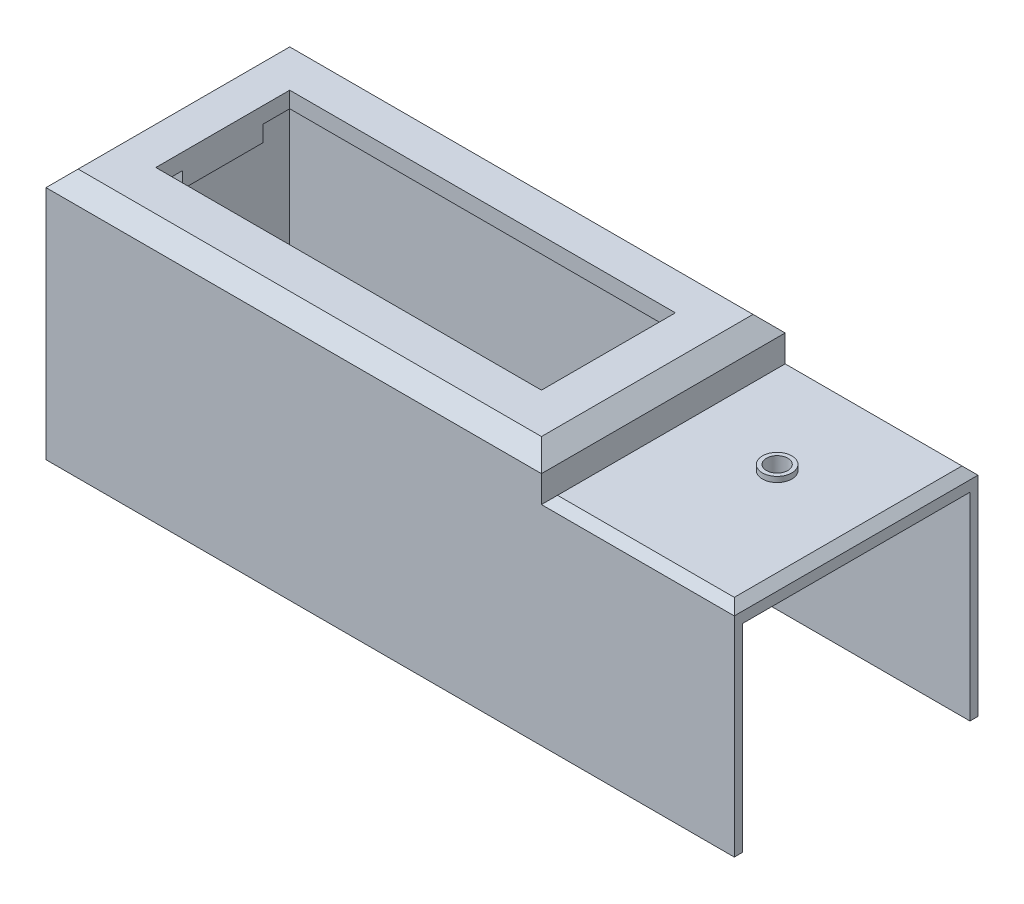
ISO-10303-21;
HEADER;
FILE_DESCRIPTION(('STEP AP214'),'2;1');
FILE_NAME('part.step','',(''),(''),'','','');
FILE_SCHEMA(('AUTOMOTIVE_DESIGN { 1 0 10303 214 1 1 1 1 }'));
ENDSEC;
DATA;
#1=APPLICATION_CONTEXT('core data for automotive mechanical design processes');
#2=APPLICATION_PROTOCOL_DEFINITION('international standard','automotive_design',2000,#1);
#3=PRODUCT_CONTEXT('',#1,'mechanical');
#4=PRODUCT('Part','Part','',(#3));
#5=PRODUCT_RELATED_PRODUCT_CATEGORY('part','',(#4));
#6=PRODUCT_DEFINITION_FORMATION('','',#4);
#7=PRODUCT_DEFINITION_CONTEXT('part definition',#1,'design');
#8=PRODUCT_DEFINITION('design','',#6,#7);
#9=PRODUCT_DEFINITION_SHAPE('','',#8);
#10=(LENGTH_UNIT() NAMED_UNIT(*) SI_UNIT(.MILLI.,.METRE.));
#11=(NAMED_UNIT(*) PLANE_ANGLE_UNIT() SI_UNIT($,.RADIAN.));
#12=(NAMED_UNIT(*) SI_UNIT($,.STERADIAN.) SOLID_ANGLE_UNIT());
#13=UNCERTAINTY_MEASURE_WITH_UNIT(LENGTH_MEASURE(1.E-05),#10,'distance_accuracy_value','');
#14=(GEOMETRIC_REPRESENTATION_CONTEXT(3) GLOBAL_UNCERTAINTY_ASSIGNED_CONTEXT((#13)) GLOBAL_UNIT_ASSIGNED_CONTEXT((#10,
#11,#12)) REPRESENTATION_CONTEXT('',''));
#15=CARTESIAN_POINT('',(0.,0.,0.));
#16=DIRECTION('',(0.,0.,1.));
#17=DIRECTION('',(1.,0.,0.));
#18=AXIS2_PLACEMENT_3D('',#15,#16,#17);
#19=CARTESIAN_POINT('',(0.,-3.,0.));
#20=DIRECTION('',(0.,1.,0.));
#21=DIRECTION('',(0.,0.,1.));
#22=AXIS2_PLACEMENT_3D('',#19,#20,#21);
#23=PLANE('',#22);
#24=DIRECTION('',(1.,0.,0.));
#25=VECTOR('',#24,1.);
#26=CARTESIAN_POINT('',(45.,-3.,-21.));
#27=LINE('',#26,#25);
#28=CARTESIAN_POINT('',(-44.5,-3.,-21.));
#29=VERTEX_POINT('',#28);
#30=CARTESIAN_POINT('',(45.,-3.,-21.));
#31=VERTEX_POINT('',#30);
#32=EDGE_CURVE('E363',#29,#31,#27,.T.);
#33=ORIENTED_EDGE('',*,*,#32,.T.);
#34=DIRECTION('',(0.,0.,1.));
#35=VECTOR('',#34,1.);
#36=CARTESIAN_POINT('',(45.,-3.,-21.));
#37=LINE('',#36,#35);
#38=CARTESIAN_POINT('',(45.,-3.,21.5));
#39=VERTEX_POINT('',#38);
#40=EDGE_CURVE('E353',#31,#39,#37,.T.);
#41=ORIENTED_EDGE('',*,*,#40,.T.);
#42=DIRECTION('',(-1.,0.,0.));
#43=VECTOR('',#42,1.);
#44=CARTESIAN_POINT('',(45.,-3.,21.5));
#45=LINE('',#44,#43);
#46=CARTESIAN_POINT('',(-44.5,-3.,21.5));
#47=VERTEX_POINT('',#46);
#48=EDGE_CURVE('E356',#39,#47,#45,.T.);
#49=ORIENTED_EDGE('',*,*,#48,.T.);
#50=DIRECTION('',(0.,0.,-1.));
#51=VECTOR('',#50,1.);
#52=CARTESIAN_POINT('',(-44.5,-3.,-21.));
#53=LINE('',#52,#51);
#54=EDGE_CURVE('E360',#47,#29,#53,.T.);
#55=ORIENTED_EDGE('',*,*,#54,.T.);
#56=EDGE_LOOP('',(#33,#41,#49,#55));
#57=FACE_BOUND('',#56,.T.);
#58=DIRECTION('',(-1.,0.,0.));
#59=VECTOR('',#58,1.);
#60=CARTESIAN_POINT('',(-36.,-3.,7.5));
#61=LINE('',#60,#59);
#62=CARTESIAN_POINT('',(-36.,-3.,7.5));
#63=VERTEX_POINT('',#62);
#64=CARTESIAN_POINT('',(-40.,-3.,7.5));
#65=VERTEX_POINT('',#64);
#66=EDGE_CURVE('E334',#63,#65,#61,.T.);
#67=ORIENTED_EDGE('',*,*,#66,.F.);
#68=DIRECTION('',(0.,0.,1.));
#69=VECTOR('',#68,1.);
#70=CARTESIAN_POINT('',(-36.,-3.,0.));
#71=LINE('',#70,#69);
#72=CARTESIAN_POINT('',(-36.,-3.,12.5));
#73=VERTEX_POINT('',#72);
#74=EDGE_CURVE('E402',#63,#73,#71,.T.);
#75=ORIENTED_EDGE('',*,*,#74,.T.);
#76=DIRECTION('',(1.,0.,0.));
#77=VECTOR('',#76,1.);
#78=CARTESIAN_POINT('',(0.,-3.,12.5));
#79=LINE('',#78,#77);
#80=CARTESIAN_POINT('',(36.,-3.,12.5));
#81=VERTEX_POINT('',#80);
#82=EDGE_CURVE('E405',#73,#81,#79,.T.);
#83=ORIENTED_EDGE('',*,*,#82,.T.);
#84=DIRECTION('',(0.,0.,-1.));
#85=VECTOR('',#84,1.);
#86=CARTESIAN_POINT('',(36.,-3.,0.));
#87=LINE('',#86,#85);
#88=CARTESIAN_POINT('',(36.,-3.,-12.5));
#89=VERTEX_POINT('',#88);
#90=EDGE_CURVE('E390',#81,#89,#87,.T.);
#91=ORIENTED_EDGE('',*,*,#90,.T.);
#92=DIRECTION('',(-1.,0.,0.));
#93=VECTOR('',#92,1.);
#94=CARTESIAN_POINT('',(0.,-3.,-12.5));
#95=LINE('',#94,#93);
#96=CARTESIAN_POINT('',(-36.,-3.,-12.5));
#97=VERTEX_POINT('',#96);
#98=EDGE_CURVE('E399',#89,#97,#95,.T.);
#99=ORIENTED_EDGE('',*,*,#98,.T.);
#100=CARTESIAN_POINT('',(-36.,-3.,-7.5));
#101=VERTEX_POINT('',#100);
#102=EDGE_CURVE('E403',#97,#101,#71,.T.);
#103=ORIENTED_EDGE('',*,*,#102,.T.);
#104=DIRECTION('',(1.,0.,0.));
#105=VECTOR('',#104,1.);
#106=CARTESIAN_POINT('',(-36.,-3.,-7.5));
#107=LINE('',#106,#105);
#108=CARTESIAN_POINT('',(-40.,-3.,-7.5));
#109=VERTEX_POINT('',#108);
#110=EDGE_CURVE('E172',#109,#101,#107,.T.);
#111=ORIENTED_EDGE('',*,*,#110,.F.);
#112=DIRECTION('',(0.,0.,-1.));
#113=VECTOR('',#112,1.);
#114=CARTESIAN_POINT('',(-40.,-3.,7.5));
#115=LINE('',#114,#113);
#116=EDGE_CURVE('E167',#65,#109,#115,.T.);
#117=ORIENTED_EDGE('',*,*,#116,.F.);
#118=EDGE_LOOP('',(#67,#75,#83,#91,#99,#103,#111,#117));
#119=FACE_BOUND('',#118,.T.);
#120=ADVANCED_FACE('F149',(#57,#119),#23,.F.);
#121=CARTESIAN_POINT('',(0.,-10.,0.));
#122=DIRECTION('',(0.,-1.,0.));
#123=DIRECTION('',(0.,0.,-1.));
#124=AXIS2_PLACEMENT_3D('',#121,#122,#123);
#125=PLANE('',#124);
#126=CARTESIAN_POINT('',(64.5,-10.,-3.));
#127=DIRECTION('',(0.,-1.,0.));
#128=DIRECTION('',(0.,0.,-1.));
#129=AXIS2_PLACEMENT_3D('',#126,#127,#128);
#130=CIRCLE('',#129,2.);
#131=CARTESIAN_POINT('',(64.5,-10.,-5.));
#132=VERTEX_POINT('',#131);
#133=EDGE_CURVE('E154',#132,#132,#130,.T.);
#134=ORIENTED_EDGE('',*,*,#133,.F.);
#135=EDGE_LOOP('',(#134));
#136=FACE_BOUND('',#135,.T.);
#137=DIRECTION('',(0.,0.,1.));
#138=VECTOR('',#137,1.);
#139=CARTESIAN_POINT('',(45.,-10.,21.5));
#140=LINE('',#139,#138);
#141=CARTESIAN_POINT('',(45.,-10.,-21.));
#142=VERTEX_POINT('',#141);
#143=CARTESIAN_POINT('',(45.,-10.,21.5));
#144=VERTEX_POINT('',#143);
#145=EDGE_CURVE('E345',#142,#144,#140,.T.);
#146=ORIENTED_EDGE('',*,*,#145,.F.);
#147=DIRECTION('',(1.,0.,0.));
#148=VECTOR('',#147,1.);
#149=CARTESIAN_POINT('',(-44.5,-10.,-21.));
#150=LINE('',#149,#148);
#151=CARTESIAN_POINT('',(82.5,-10.,-21.));
#152=VERTEX_POINT('',#151);
#153=EDGE_CURVE('E159',#142,#152,#150,.T.);
#154=ORIENTED_EDGE('',*,*,#153,.T.);
#155=DIRECTION('',(0.,0.,-1.));
#156=VECTOR('',#155,1.);
#157=CARTESIAN_POINT('',(82.5,-10.,23.));
#158=LINE('',#157,#156);
#159=CARTESIAN_POINT('',(82.5,-10.,21.5));
#160=VERTEX_POINT('',#159);
#161=EDGE_CURVE('E333',#160,#152,#158,.T.);
#162=ORIENTED_EDGE('',*,*,#161,.F.);
#163=DIRECTION('',(-1.,0.,0.));
#164=VECTOR('',#163,1.);
#165=CARTESIAN_POINT('',(-44.5,-10.,21.5));
#166=LINE('',#165,#164);
#167=EDGE_CURVE('E665',#160,#144,#166,.T.);
#168=ORIENTED_EDGE('',*,*,#167,.T.);
#169=EDGE_LOOP('',(#146,#154,#162,#168));
#170=FACE_BOUND('',#169,.T.);
#171=ADVANCED_FACE('F482',(#136,#170),#125,.T.);
#172=CARTESIAN_POINT('',(0.,0.,0.));
#173=DIRECTION('',(0.,1.,0.));
#174=DIRECTION('',(0.,0.,1.));
#175=AXIS2_PLACEMENT_3D('',#172,#173,#174);
#176=PLANE('',#175);
#177=DIRECTION('',(1.,0.,0.));
#178=VECTOR('',#177,1.);
#179=CARTESIAN_POINT('',(-36.,0.,12.5));
#180=LINE('',#179,#178);
#181=CARTESIAN_POINT('',(-36.,0.,12.5));
#182=VERTEX_POINT('',#181);
#183=CARTESIAN_POINT('',(36.,0.,12.5));
#184=VERTEX_POINT('',#183);
#185=EDGE_CURVE('E375',#182,#184,#180,.T.);
#186=ORIENTED_EDGE('',*,*,#185,.F.);
#187=DIRECTION('',(0.,0.,1.));
#188=VECTOR('',#187,1.);
#189=CARTESIAN_POINT('',(-36.,0.,12.5));
#190=LINE('',#189,#188);
#191=CARTESIAN_POINT('',(-36.,0.,-12.5));
#192=VERTEX_POINT('',#191);
#193=EDGE_CURVE('E384',#192,#182,#190,.T.);
#194=ORIENTED_EDGE('',*,*,#193,.F.);
#195=DIRECTION('',(-1.,0.,0.));
#196=VECTOR('',#195,1.);
#197=CARTESIAN_POINT('',(-36.,0.,-12.5));
#198=LINE('',#197,#196);
#199=CARTESIAN_POINT('',(36.,0.,-12.5));
#200=VERTEX_POINT('',#199);
#201=EDGE_CURVE('E381',#200,#192,#198,.T.);
#202=ORIENTED_EDGE('',*,*,#201,.F.);
#203=DIRECTION('',(0.,0.,-1.));
#204=VECTOR('',#203,1.);
#205=CARTESIAN_POINT('',(36.,0.,12.5));
#206=LINE('',#205,#204);
#207=EDGE_CURVE('E377',#184,#200,#206,.T.);
#208=ORIENTED_EDGE('',*,*,#207,.F.);
#209=EDGE_LOOP('',(#186,#194,#202,#208));
#210=FACE_BOUND('',#209,.T.);
#211=DIRECTION('',(0.,0.,1.));
#212=VECTOR('',#211,1.);
#213=CARTESIAN_POINT('',(-43.,0.,-19.5));
#214=LINE('',#213,#212);
#215=CARTESIAN_POINT('',(-43.,0.,-19.5));
#216=VERTEX_POINT('',#215);
#217=CARTESIAN_POINT('',(-43.,0.,20.));
#218=VERTEX_POINT('',#217);
#219=EDGE_CURVE('E408',#216,#218,#214,.T.);
#220=ORIENTED_EDGE('',*,*,#219,.T.);
#221=DIRECTION('',(1.,0.,0.));
#222=VECTOR('',#221,1.);
#223=CARTESIAN_POINT('',(-43.,0.,20.));
#224=LINE('',#223,#222);
#225=CARTESIAN_POINT('',(43.5,0.,20.));
#226=VERTEX_POINT('',#225);
#227=EDGE_CURVE('E499',#218,#226,#224,.T.);
#228=ORIENTED_EDGE('',*,*,#227,.T.);
#229=DIRECTION('',(0.,0.,1.));
#230=VECTOR('',#229,1.);
#231=CARTESIAN_POINT('',(43.5,0.,-19.5));
#232=LINE('',#231,#230);
#233=CARTESIAN_POINT('',(43.5,0.,-19.5));
#234=VERTEX_POINT('',#233);
#235=EDGE_CURVE('E459',#234,#226,#232,.T.);
#236=ORIENTED_EDGE('',*,*,#235,.F.);
#237=DIRECTION('',(1.,0.,0.));
#238=VECTOR('',#237,1.);
#239=CARTESIAN_POINT('',(-43.,0.,-19.5));
#240=LINE('',#239,#238);
#241=EDGE_CURVE('E413',#216,#234,#240,.T.);
#242=ORIENTED_EDGE('',*,*,#241,.F.);
#243=EDGE_LOOP('',(#220,#228,#236,#242));
#244=FACE_BOUND('',#243,.T.);
#245=ADVANCED_FACE('F471',(#210,#244),#176,.T.);
#246=CARTESIAN_POINT('',(43.5,0.,20.));
#247=DIRECTION('',(0.,0.707106781186547,0.707106781186548));
#248=DIRECTION('',(-1.,0.,0.));
#249=AXIS2_PLACEMENT_3D('',#246,#247,#248);
#250=PLANE('',#249);
#251=ORIENTED_EDGE('',*,*,#227,.F.);
#252=CARTESIAN_POINT('',(-43.,0.,20.));
#253=CARTESIAN_POINT('',(-44.,-1.,21.));
#254=CARTESIAN_POINT('',(-45.,-2.,22.));
#255=CARTESIAN_POINT('',(-46.,-3.,23.));
#256=B_SPLINE_CURVE_WITH_KNOTS('',3,(#252,#253,#254,#255),.UNSPECIFIED.,.F.,.F.,(4,4),(0.,1.),.UNSPECIFIED.);
#257=CARTESIAN_POINT('',(-46.,-3.,23.));
#258=VERTEX_POINT('',#257);
#259=EDGE_CURVE('E433',#218,#258,#256,.T.);
#260=ORIENTED_EDGE('',*,*,#259,.T.);
#261=DIRECTION('',(1.,0.,0.));
#262=VECTOR('',#261,1.);
#263=CARTESIAN_POINT('',(-46.,-3.,23.));
#264=LINE('',#263,#262);
#265=CARTESIAN_POINT('',(46.5,-3.,23.));
#266=VERTEX_POINT('',#265);
#267=EDGE_CURVE('E522',#258,#266,#264,.T.);
#268=ORIENTED_EDGE('',*,*,#267,.T.);
#269=CARTESIAN_POINT('',(43.5,0.,20.));
#270=CARTESIAN_POINT('',(44.5,-1.,21.));
#271=CARTESIAN_POINT('',(45.5,-2.,22.));
#272=CARTESIAN_POINT('',(46.5,-3.,23.));
#273=B_SPLINE_CURVE_WITH_KNOTS('',3,(#269,#270,#271,#272),.UNSPECIFIED.,.F.,.F.,(4,4),(0.,1.),.UNSPECIFIED.);
#274=EDGE_CURVE('E423',#226,#266,#273,.T.);
#275=ORIENTED_EDGE('',*,*,#274,.F.);
#276=EDGE_LOOP('',(#251,#260,#268,#275));
#277=FACE_BOUND('',#276,.T.);
#278=ADVANCED_FACE('F481',(#277),#250,.T.);
#279=CARTESIAN_POINT('',(43.5,0.,-19.5));
#280=DIRECTION('',(0.707106781186547,0.707106781186548,0.));
#281=DIRECTION('',(0.,0.,1.));
#282=AXIS2_PLACEMENT_3D('',#279,#280,#281);
#283=PLANE('',#282);
#284=ORIENTED_EDGE('',*,*,#235,.T.);
#285=ORIENTED_EDGE('',*,*,#274,.T.);
#286=DIRECTION('',(0.,0.,-1.));
#287=VECTOR('',#286,1.);
#288=CARTESIAN_POINT('',(46.5,-3.,23.));
#289=LINE('',#288,#287);
#290=CARTESIAN_POINT('',(46.5,-3.,-22.5));
#291=VERTEX_POINT('',#290);
#292=EDGE_CURVE('E443',#266,#291,#289,.T.);
#293=ORIENTED_EDGE('',*,*,#292,.T.);
#294=CARTESIAN_POINT('',(43.5,0.,-19.5));
#295=CARTESIAN_POINT('',(44.5,-1.,-20.5));
#296=CARTESIAN_POINT('',(45.5,-2.,-21.5));
#297=CARTESIAN_POINT('',(46.5,-3.,-22.5));
#298=B_SPLINE_CURVE_WITH_KNOTS('',3,(#294,#295,#296,#297),.UNSPECIFIED.,.F.,.F.,(4,4),(0.,1.),.UNSPECIFIED.);
#299=EDGE_CURVE('E412',#234,#291,#298,.T.);
#300=ORIENTED_EDGE('',*,*,#299,.F.);
#301=EDGE_LOOP('',(#284,#285,#293,#300));
#302=FACE_BOUND('',#301,.T.);
#303=ADVANCED_FACE('F837',(#302),#283,.T.);
#304=CARTESIAN_POINT('',(-43.,0.,-19.5));
#305=DIRECTION('',(0.,0.707106781186547,-0.707106781186548));
#306=DIRECTION('',(1.,0.,0.));
#307=AXIS2_PLACEMENT_3D('',#304,#305,#306);
#308=PLANE('',#307);
#309=ORIENTED_EDGE('',*,*,#241,.T.);
#310=ORIENTED_EDGE('',*,*,#299,.T.);
#311=DIRECTION('',(-1.,0.,0.));
#312=VECTOR('',#311,1.);
#313=CARTESIAN_POINT('',(46.5,-3.,-22.5));
#314=LINE('',#313,#312);
#315=CARTESIAN_POINT('',(-46.,-3.,-22.5));
#316=VERTEX_POINT('',#315);
#317=EDGE_CURVE('E819',#291,#316,#314,.T.);
#318=ORIENTED_EDGE('',*,*,#317,.T.);
#319=CARTESIAN_POINT('',(-43.,0.,-19.5));
#320=CARTESIAN_POINT('',(-44.,-1.,-20.5));
#321=CARTESIAN_POINT('',(-45.,-2.,-21.5));
#322=CARTESIAN_POINT('',(-46.,-3.,-22.5));
#323=B_SPLINE_CURVE_WITH_KNOTS('',3,(#319,#320,#321,#322),.UNSPECIFIED.,.F.,.F.,(4,4),(0.,1.),.UNSPECIFIED.);
#324=EDGE_CURVE('E409',#216,#316,#323,.T.);
#325=ORIENTED_EDGE('',*,*,#324,.F.);
#326=EDGE_LOOP('',(#309,#310,#318,#325));
#327=FACE_BOUND('',#326,.T.);
#328=ADVANCED_FACE('F874',(#327),#308,.T.);
#329=CARTESIAN_POINT('',(-43.,0.,20.));
#330=DIRECTION('',(-0.707106781186547,0.707106781186548,0.));
#331=DIRECTION('',(0.,0.,-1.));
#332=AXIS2_PLACEMENT_3D('',#329,#330,#331);
#333=PLANE('',#332);
#334=ORIENTED_EDGE('',*,*,#219,.F.);
#335=ORIENTED_EDGE('',*,*,#324,.T.);
#336=DIRECTION('',(0.,0.,1.));
#337=VECTOR('',#336,1.);
#338=CARTESIAN_POINT('',(-46.,-3.,-22.5));
#339=LINE('',#338,#337);
#340=EDGE_CURVE('E526',#316,#258,#339,.T.);
#341=ORIENTED_EDGE('',*,*,#340,.T.);
#342=ORIENTED_EDGE('',*,*,#259,.F.);
#343=EDGE_LOOP('',(#334,#335,#341,#342));
#344=FACE_BOUND('',#343,.T.);
#345=ADVANCED_FACE('F151',(#344),#333,.T.);
#346=CARTESIAN_POINT('',(-36.,-6.,12.5));
#347=DIRECTION('',(0.,0.,1.));
#348=DIRECTION('',(1.,0.,0.));
#349=AXIS2_PLACEMENT_3D('',#346,#347,#348);
#350=PLANE('',#349);
#351=DIRECTION('',(0.,1.,0.));
#352=VECTOR('',#351,1.);
#353=CARTESIAN_POINT('',(-36.,-6.,12.5));
#354=LINE('',#353,#352);
#355=EDGE_CURVE('E388',#73,#182,#354,.T.);
#356=ORIENTED_EDGE('',*,*,#355,.T.);
#357=ORIENTED_EDGE('',*,*,#185,.T.);
#358=DIRECTION('',(0.,1.,0.));
#359=VECTOR('',#358,1.);
#360=CARTESIAN_POINT('',(36.,-6.,12.5));
#361=LINE('',#360,#359);
#362=EDGE_CURVE('E387',#81,#184,#361,.T.);
#363=ORIENTED_EDGE('',*,*,#362,.F.);
#364=ORIENTED_EDGE('',*,*,#82,.F.);
#365=EDGE_LOOP('',(#356,#357,#363,#364));
#366=FACE_BOUND('',#365,.T.);
#367=ADVANCED_FACE('F484',(#366),#350,.F.);
#368=CARTESIAN_POINT('',(-36.,-6.,12.5));
#369=DIRECTION('',(-1.,0.,0.));
#370=DIRECTION('',(0.,0.,1.));
#371=AXIS2_PLACEMENT_3D('',#368,#369,#370);
#372=PLANE('',#371);
#373=DIRECTION('',(0.,1.,0.));
#374=VECTOR('',#373,1.);
#375=CARTESIAN_POINT('',(-36.,-6.,-12.5));
#376=LINE('',#375,#374);
#377=EDGE_CURVE('E391',#97,#192,#376,.T.);
#378=ORIENTED_EDGE('',*,*,#377,.T.);
#379=ORIENTED_EDGE('',*,*,#193,.T.);
#380=ORIENTED_EDGE('',*,*,#355,.F.);
#381=ORIENTED_EDGE('',*,*,#74,.F.);
#382=DIRECTION('',(0.,1.,0.));
#383=VECTOR('',#382,1.);
#384=CARTESIAN_POINT('',(-36.,-6.,7.5));
#385=LINE('',#384,#383);
#386=CARTESIAN_POINT('',(-36.,-6.,7.5));
#387=VERTEX_POINT('',#386);
#388=EDGE_CURVE('E624',#387,#63,#385,.T.);
#389=ORIENTED_EDGE('',*,*,#388,.F.);
#390=DIRECTION('',(0.,0.,1.));
#391=VECTOR('',#390,1.);
#392=CARTESIAN_POINT('',(-36.,-6.,7.5));
#393=LINE('',#392,#391);
#394=CARTESIAN_POINT('',(-36.,-6.,-7.5));
#395=VERTEX_POINT('',#394);
#396=EDGE_CURVE('E1228',#395,#387,#393,.T.);
#397=ORIENTED_EDGE('',*,*,#396,.F.);
#398=DIRECTION('',(0.,1.,0.));
#399=VECTOR('',#398,1.);
#400=CARTESIAN_POINT('',(-36.,-6.,-7.5));
#401=LINE('',#400,#399);
#402=EDGE_CURVE('E1226',#395,#101,#401,.T.);
#403=ORIENTED_EDGE('',*,*,#402,.T.);
#404=ORIENTED_EDGE('',*,*,#102,.F.);
#405=EDGE_LOOP('',(#378,#379,#380,#381,#389,#397,#403,#404));
#406=FACE_BOUND('',#405,.T.);
#407=ADVANCED_FACE('F599',(#406),#372,.F.);
#408=CARTESIAN_POINT('',(-36.,-6.,-12.5));
#409=DIRECTION('',(0.,0.,-1.));
#410=DIRECTION('',(-1.,0.,0.));
#411=AXIS2_PLACEMENT_3D('',#408,#409,#410);
#412=PLANE('',#411);
#413=DIRECTION('',(0.,1.,0.));
#414=VECTOR('',#413,1.);
#415=CARTESIAN_POINT('',(36.,-6.,-12.5));
#416=LINE('',#415,#414);
#417=EDGE_CURVE('E393',#89,#200,#416,.T.);
#418=ORIENTED_EDGE('',*,*,#417,.T.);
#419=ORIENTED_EDGE('',*,*,#201,.T.);
#420=ORIENTED_EDGE('',*,*,#377,.F.);
#421=ORIENTED_EDGE('',*,*,#98,.F.);
#422=EDGE_LOOP('',(#418,#419,#420,#421));
#423=FACE_BOUND('',#422,.T.);
#424=ADVANCED_FACE('F602',(#423),#412,.F.);
#425=CARTESIAN_POINT('',(36.,-6.,12.5));
#426=DIRECTION('',(1.,0.,0.));
#427=DIRECTION('',(0.,0.,-1.));
#428=AXIS2_PLACEMENT_3D('',#425,#426,#427);
#429=PLANE('',#428);
#430=ORIENTED_EDGE('',*,*,#362,.T.);
#431=ORIENTED_EDGE('',*,*,#207,.T.);
#432=ORIENTED_EDGE('',*,*,#417,.F.);
#433=ORIENTED_EDGE('',*,*,#90,.F.);
#434=EDGE_LOOP('',(#430,#431,#432,#433));
#435=FACE_BOUND('',#434,.T.);
#436=ADVANCED_FACE('F596',(#435),#429,.F.);
#437=CARTESIAN_POINT('',(-46.,-8.,23.));
#438=DIRECTION('',(1.,0.,0.));
#439=DIRECTION('',(0.,0.,-1.));
#440=AXIS2_PLACEMENT_3D('',#437,#438,#439);
#441=PLANE('',#440);
#442=ORIENTED_EDGE('',*,*,#340,.F.);
#443=DIRECTION('',(0.,1.,0.));
#444=VECTOR('',#443,1.);
#445=CARTESIAN_POINT('',(-46.,-8.,-22.5));
#446=LINE('',#445,#444);
#447=CARTESIAN_POINT('',(-46.,-47.,-22.5));
#448=VERTEX_POINT('',#447);
#449=EDGE_CURVE('E378',#448,#316,#446,.T.);
#450=ORIENTED_EDGE('',*,*,#449,.F.);
#451=DIRECTION('',(0.,0.,-1.));
#452=VECTOR('',#451,1.);
#453=CARTESIAN_POINT('',(-46.,-47.,23.));
#454=LINE('',#453,#452);
#455=CARTESIAN_POINT('',(-46.,-47.,23.));
#456=VERTEX_POINT('',#455);
#457=EDGE_CURVE('E802',#456,#448,#454,.T.);
#458=ORIENTED_EDGE('',*,*,#457,.F.);
#459=DIRECTION('',(0.,1.,0.));
#460=VECTOR('',#459,1.);
#461=CARTESIAN_POINT('',(-46.,-8.,23.));
#462=LINE('',#461,#460);
#463=EDGE_CURVE('E554',#456,#258,#462,.T.);
#464=ORIENTED_EDGE('',*,*,#463,.T.);
#465=EDGE_LOOP('',(#442,#450,#458,#464));
#466=FACE_BOUND('',#465,.T.);
#467=ADVANCED_FACE('F585',(#466),#441,.F.);
#468=CARTESIAN_POINT('',(-46.,-8.,-22.5));
#469=DIRECTION('',(0.,0.,1.));
#470=DIRECTION('',(1.,0.,0.));
#471=AXIS2_PLACEMENT_3D('',#468,#469,#470);
#472=PLANE('',#471);
#473=ORIENTED_EDGE('',*,*,#317,.F.);
#474=DIRECTION('',(0.,1.,0.));
#475=VECTOR('',#474,1.);
#476=CARTESIAN_POINT('',(46.5,-8.,-22.5));
#477=LINE('',#476,#475);
#478=CARTESIAN_POINT('',(46.5,-8.,-22.5));
#479=VERTEX_POINT('',#478);
#480=EDGE_CURVE('E568',#479,#291,#477,.T.);
#481=ORIENTED_EDGE('',*,*,#480,.F.);
#482=DIRECTION('',(1.,0.,0.));
#483=VECTOR('',#482,1.);
#484=CARTESIAN_POINT('',(-46.,-8.,-22.5));
#485=LINE('',#484,#483);
#486=CARTESIAN_POINT('',(82.5,-8.,-22.5));
#487=VERTEX_POINT('',#486);
#488=EDGE_CURVE('E352',#479,#487,#485,.T.);
#489=ORIENTED_EDGE('',*,*,#488,.T.);
#490=DIRECTION('',(0.,1.,0.));
#491=VECTOR('',#490,1.);
#492=CARTESIAN_POINT('',(82.5,-10.,-22.5));
#493=LINE('',#492,#491);
#494=CARTESIAN_POINT('',(82.5,-47.,-22.5));
#495=VERTEX_POINT('',#494);
#496=EDGE_CURVE('E357',#495,#487,#493,.T.);
#497=ORIENTED_EDGE('',*,*,#496,.F.);
#498=DIRECTION('',(1.,0.,0.));
#499=VECTOR('',#498,1.);
#500=CARTESIAN_POINT('',(-46.,-47.,-22.5));
#501=LINE('',#500,#499);
#502=EDGE_CURVE('E340',#448,#495,#501,.T.);
#503=ORIENTED_EDGE('',*,*,#502,.F.);
#504=ORIENTED_EDGE('',*,*,#449,.T.);
#505=EDGE_LOOP('',(#473,#481,#489,#497,#503,#504));
#506=FACE_BOUND('',#505,.T.);
#507=ADVANCED_FACE('F595',(#506),#472,.F.);
#508=CARTESIAN_POINT('',(46.5,-8.,23.));
#509=DIRECTION('',(-1.,0.,0.));
#510=DIRECTION('',(0.,0.,1.));
#511=AXIS2_PLACEMENT_3D('',#508,#509,#510);
#512=PLANE('',#511);
#513=ORIENTED_EDGE('',*,*,#292,.F.);
#514=DIRECTION('',(0.,1.,0.));
#515=VECTOR('',#514,1.);
#516=CARTESIAN_POINT('',(46.5,-8.,23.));
#517=LINE('',#516,#515);
#518=CARTESIAN_POINT('',(46.5,-8.,23.));
#519=VERTEX_POINT('',#518);
#520=EDGE_CURVE('E561',#519,#266,#517,.T.);
#521=ORIENTED_EDGE('',*,*,#520,.F.);
#522=DIRECTION('',(0.,0.,1.));
#523=VECTOR('',#522,1.);
#524=CARTESIAN_POINT('',(46.5,-8.,23.));
#525=LINE('',#524,#523);
#526=EDGE_CURVE('E374',#479,#519,#525,.T.);
#527=ORIENTED_EDGE('',*,*,#526,.F.);
#528=ORIENTED_EDGE('',*,*,#480,.T.);
#529=EDGE_LOOP('',(#513,#521,#527,#528));
#530=FACE_BOUND('',#529,.T.);
#531=ADVANCED_FACE('F910',(#530),#512,.F.);
#532=CARTESIAN_POINT('',(-46.,-8.,23.));
#533=DIRECTION('',(0.,0.,-1.));
#534=DIRECTION('',(-1.,0.,0.));
#535=AXIS2_PLACEMENT_3D('',#532,#533,#534);
#536=PLANE('',#535);
#537=ORIENTED_EDGE('',*,*,#267,.F.);
#538=ORIENTED_EDGE('',*,*,#463,.F.);
#539=DIRECTION('',(-1.,0.,0.));
#540=VECTOR('',#539,1.);
#541=CARTESIAN_POINT('',(-46.,-47.,23.));
#542=LINE('',#541,#540);
#543=CARTESIAN_POINT('',(82.5,-47.,23.));
#544=VERTEX_POINT('',#543);
#545=EDGE_CURVE('E341',#544,#456,#542,.T.);
#546=ORIENTED_EDGE('',*,*,#545,.F.);
#547=DIRECTION('',(0.,1.,0.));
#548=VECTOR('',#547,1.);
#549=CARTESIAN_POINT('',(82.5,-10.,23.));
#550=LINE('',#549,#548);
#551=CARTESIAN_POINT('',(82.5,-8.,23.));
#552=VERTEX_POINT('',#551);
#553=EDGE_CURVE('E531',#544,#552,#550,.T.);
#554=ORIENTED_EDGE('',*,*,#553,.T.);
#555=DIRECTION('',(-1.,0.,0.));
#556=VECTOR('',#555,1.);
#557=CARTESIAN_POINT('',(-46.,-8.,23.));
#558=LINE('',#557,#556);
#559=EDGE_CURVE('E534',#552,#519,#558,.T.);
#560=ORIENTED_EDGE('',*,*,#559,.T.);
#561=ORIENTED_EDGE('',*,*,#520,.T.);
#562=EDGE_LOOP('',(#537,#538,#546,#554,#560,#561));
#563=FACE_BOUND('',#562,.T.);
#564=ADVANCED_FACE('F810',(#563),#536,.F.);
#565=CARTESIAN_POINT('',(45.,-8.,-21.));
#566=DIRECTION('',(-1.,0.,0.));
#567=DIRECTION('',(0.,0.,1.));
#568=AXIS2_PLACEMENT_3D('',#565,#566,#567);
#569=PLANE('',#568);
#570=ORIENTED_EDGE('',*,*,#40,.F.);
#571=DIRECTION('',(0.,1.,0.));
#572=VECTOR('',#571,1.);
#573=CARTESIAN_POINT('',(45.,-8.,-21.));
#574=LINE('',#573,#572);
#575=EDGE_CURVE('E366',#142,#31,#574,.T.);
#576=ORIENTED_EDGE('',*,*,#575,.F.);
#577=ORIENTED_EDGE('',*,*,#145,.T.);
#578=DIRECTION('',(0.,1.,0.));
#579=VECTOR('',#578,1.);
#580=CARTESIAN_POINT('',(45.,-8.,21.5));
#581=LINE('',#580,#579);
#582=EDGE_CURVE('E371',#144,#39,#581,.T.);
#583=ORIENTED_EDGE('',*,*,#582,.T.);
#584=EDGE_LOOP('',(#570,#576,#577,#583));
#585=FACE_BOUND('',#584,.T.);
#586=ADVANCED_FACE('F921',(#585),#569,.T.);
#587=CARTESIAN_POINT('',(45.,-8.,21.5));
#588=DIRECTION('',(0.,0.,-1.));
#589=DIRECTION('',(-1.,0.,0.));
#590=AXIS2_PLACEMENT_3D('',#587,#588,#589);
#591=PLANE('',#590);
#592=ORIENTED_EDGE('',*,*,#48,.F.);
#593=ORIENTED_EDGE('',*,*,#582,.F.);
#594=ORIENTED_EDGE('',*,*,#167,.F.);
#595=DIRECTION('',(0.,1.,0.));
#596=VECTOR('',#595,1.);
#597=CARTESIAN_POINT('',(82.5,-10.,21.5));
#598=LINE('',#597,#596);
#599=CARTESIAN_POINT('',(82.5,-47.,21.5));
#600=VERTEX_POINT('',#599);
#601=EDGE_CURVE('E1240',#600,#160,#598,.T.);
#602=ORIENTED_EDGE('',*,*,#601,.F.);
#603=DIRECTION('',(-1.,0.,0.));
#604=VECTOR('',#603,1.);
#605=CARTESIAN_POINT('',(-44.5,-47.,21.5));
#606=LINE('',#605,#604);
#607=CARTESIAN_POINT('',(-44.5,-47.,21.5));
#608=VERTEX_POINT('',#607);
#609=EDGE_CURVE('E323',#600,#608,#606,.T.);
#610=ORIENTED_EDGE('',*,*,#609,.T.);
#611=DIRECTION('',(0.,1.,0.));
#612=VECTOR('',#611,1.);
#613=CARTESIAN_POINT('',(-44.5,-8.,21.5));
#614=LINE('',#613,#612);
#615=EDGE_CURVE('E369',#608,#47,#614,.T.);
#616=ORIENTED_EDGE('',*,*,#615,.T.);
#617=EDGE_LOOP('',(#592,#593,#594,#602,#610,#616));
#618=FACE_BOUND('',#617,.T.);
#619=ADVANCED_FACE('F924',(#618),#591,.T.);
#620=CARTESIAN_POINT('',(-44.5,-8.,-21.));
#621=DIRECTION('',(1.,0.,0.));
#622=DIRECTION('',(0.,0.,-1.));
#623=AXIS2_PLACEMENT_3D('',#620,#621,#622);
#624=PLANE('',#623);
#625=ORIENTED_EDGE('',*,*,#54,.F.);
#626=ORIENTED_EDGE('',*,*,#615,.F.);
#627=DIRECTION('',(0.,0.,-1.));
#628=VECTOR('',#627,1.);
#629=CARTESIAN_POINT('',(-44.5,-47.,21.5));
#630=LINE('',#629,#628);
#631=CARTESIAN_POINT('',(-44.5,-47.,-21.));
#632=VERTEX_POINT('',#631);
#633=EDGE_CURVE('E324',#608,#632,#630,.T.);
#634=ORIENTED_EDGE('',*,*,#633,.T.);
#635=DIRECTION('',(0.,1.,0.));
#636=VECTOR('',#635,1.);
#637=CARTESIAN_POINT('',(-44.5,-8.,-21.));
#638=LINE('',#637,#636);
#639=EDGE_CURVE('E318',#632,#29,#638,.T.);
#640=ORIENTED_EDGE('',*,*,#639,.T.);
#641=EDGE_LOOP('',(#625,#626,#634,#640));
#642=FACE_BOUND('',#641,.T.);
#643=ADVANCED_FACE('F928',(#642),#624,.T.);
#644=CARTESIAN_POINT('',(45.,-8.,-21.));
#645=DIRECTION('',(0.,0.,1.));
#646=DIRECTION('',(1.,0.,0.));
#647=AXIS2_PLACEMENT_3D('',#644,#645,#646);
#648=PLANE('',#647);
#649=ORIENTED_EDGE('',*,*,#32,.F.);
#650=ORIENTED_EDGE('',*,*,#639,.F.);
#651=DIRECTION('',(1.,0.,0.));
#652=VECTOR('',#651,1.);
#653=CARTESIAN_POINT('',(-44.5,-47.,-21.));
#654=LINE('',#653,#652);
#655=CARTESIAN_POINT('',(82.5,-47.,-21.));
#656=VERTEX_POINT('',#655);
#657=EDGE_CURVE('E312',#632,#656,#654,.T.);
#658=ORIENTED_EDGE('',*,*,#657,.T.);
#659=DIRECTION('',(0.,-1.,0.));
#660=VECTOR('',#659,1.);
#661=CARTESIAN_POINT('',(82.5,-10.,-21.));
#662=LINE('',#661,#660);
#663=EDGE_CURVE('E316',#152,#656,#662,.T.);
#664=ORIENTED_EDGE('',*,*,#663,.F.);
#665=ORIENTED_EDGE('',*,*,#153,.F.);
#666=ORIENTED_EDGE('',*,*,#575,.T.);
#667=EDGE_LOOP('',(#649,#650,#658,#664,#665,#666));
#668=FACE_BOUND('',#667,.T.);
#669=ADVANCED_FACE('F315',(#668),#648,.T.);
#670=CARTESIAN_POINT('',(82.5,-10.,23.));
#671=DIRECTION('',(-1.,0.,0.));
#672=DIRECTION('',(0.,0.,1.));
#673=AXIS2_PLACEMENT_3D('',#670,#671,#672);
#674=PLANE('',#673);
#675=ORIENTED_EDGE('',*,*,#161,.T.);
#676=ORIENTED_EDGE('',*,*,#663,.T.);
#677=DIRECTION('',(0.,0.,1.));
#678=VECTOR('',#677,1.);
#679=CARTESIAN_POINT('',(82.5,-47.,23.));
#680=LINE('',#679,#678);
#681=EDGE_CURVE('E330',#495,#656,#680,.T.);
#682=ORIENTED_EDGE('',*,*,#681,.F.);
#683=ORIENTED_EDGE('',*,*,#496,.T.);
#684=DIRECTION('',(0.,0.,1.));
#685=VECTOR('',#684,1.);
#686=CARTESIAN_POINT('',(82.5,-8.,23.));
#687=LINE('',#686,#685);
#688=EDGE_CURVE('E542',#487,#552,#687,.T.);
#689=ORIENTED_EDGE('',*,*,#688,.T.);
#690=ORIENTED_EDGE('',*,*,#553,.F.);
#691=EDGE_CURVE('E342',#600,#544,#680,.T.);
#692=ORIENTED_EDGE('',*,*,#691,.F.);
#693=ORIENTED_EDGE('',*,*,#601,.T.);
#694=EDGE_LOOP('',(#675,#676,#682,#683,#689,#690,#692,#693));
#695=FACE_BOUND('',#694,.T.);
#696=ADVANCED_FACE('F328',(#695),#674,.F.);
#697=CARTESIAN_POINT('',(0.,-47.,0.));
#698=DIRECTION('',(0.,-1.,0.));
#699=DIRECTION('',(0.,0.,-1.));
#700=AXIS2_PLACEMENT_3D('',#697,#698,#699);
#701=PLANE('',#700);
#702=ORIENTED_EDGE('',*,*,#681,.T.);
#703=ORIENTED_EDGE('',*,*,#657,.F.);
#704=ORIENTED_EDGE('',*,*,#633,.F.);
#705=ORIENTED_EDGE('',*,*,#609,.F.);
#706=ORIENTED_EDGE('',*,*,#691,.T.);
#707=ORIENTED_EDGE('',*,*,#545,.T.);
#708=ORIENTED_EDGE('',*,*,#457,.T.);
#709=ORIENTED_EDGE('',*,*,#502,.T.);
#710=EDGE_LOOP('',(#702,#703,#704,#705,#706,#707,#708,#709));
#711=FACE_BOUND('',#710,.T.);
#712=ADVANCED_FACE('F337',(#711),#701,.T.);
#713=CARTESIAN_POINT('',(0.,-6.5,0.));
#714=DIRECTION('',(0.,-1.,0.));
#715=DIRECTION('',(0.,0.,-1.));
#716=AXIS2_PLACEMENT_3D('',#713,#714,#715);
#717=PLANE('',#716);
#718=CARTESIAN_POINT('',(64.5,-6.5,-3.));
#719=DIRECTION('',(0.,1.,0.));
#720=DIRECTION('',(0.,0.,1.));
#721=AXIS2_PLACEMENT_3D('',#718,#719,#720);
#722=CIRCLE('',#721,2.75000000000001);
#723=CARTESIAN_POINT('',(64.5,-6.5,-0.249999999999992));
#724=VERTEX_POINT('',#723);
#725=EDGE_CURVE('E13',#724,#724,#722,.T.);
#726=ORIENTED_EDGE('',*,*,#725,.F.);
#727=EDGE_LOOP('',(#726));
#728=FACE_BOUND('',#727,.T.);
#729=DIRECTION('',(0.,0.,-1.));
#730=VECTOR('',#729,1.);
#731=CARTESIAN_POINT('',(81.,-6.5,-21.));
#732=LINE('',#731,#730);
#733=CARTESIAN_POINT('',(81.,-6.5,21.5));
#734=VERTEX_POINT('',#733);
#735=CARTESIAN_POINT('',(81.,-6.5,-21.));
#736=VERTEX_POINT('',#735);
#737=EDGE_CURVE('E641',#734,#736,#732,.T.);
#738=ORIENTED_EDGE('',*,*,#737,.T.);
#739=DIRECTION('',(-1.,0.,0.));
#740=VECTOR('',#739,1.);
#741=CARTESIAN_POINT('',(81.,-6.5,-21.));
#742=LINE('',#741,#740);
#743=CARTESIAN_POINT('',(48.,-6.5,-21.));
#744=VERTEX_POINT('',#743);
#745=EDGE_CURVE('E674',#736,#744,#742,.T.);
#746=ORIENTED_EDGE('',*,*,#745,.T.);
#747=DIRECTION('',(0.,0.,1.));
#748=VECTOR('',#747,1.);
#749=CARTESIAN_POINT('',(48.,-6.5,-21.));
#750=LINE('',#749,#748);
#751=CARTESIAN_POINT('',(48.,-6.5,21.5));
#752=VERTEX_POINT('',#751);
#753=EDGE_CURVE('E688',#744,#752,#750,.T.);
#754=ORIENTED_EDGE('',*,*,#753,.T.);
#755=DIRECTION('',(1.,0.,0.));
#756=VECTOR('',#755,1.);
#757=CARTESIAN_POINT('',(81.,-6.5,21.5));
#758=LINE('',#757,#756);
#759=EDGE_CURVE('E729',#752,#734,#758,.T.);
#760=ORIENTED_EDGE('',*,*,#759,.T.);
#761=EDGE_LOOP('',(#738,#746,#754,#760));
#762=FACE_BOUND('',#761,.T.);
#763=ADVANCED_FACE('F701',(#728,#762),#717,.F.);
#764=CARTESIAN_POINT('',(81.,-6.5,-21.));
#765=DIRECTION('',(0.707106781186547,0.707106781186548,0.));
#766=DIRECTION('',(0.,0.,1.));
#767=AXIS2_PLACEMENT_3D('',#764,#765,#766);
#768=PLANE('',#767);
#769=ORIENTED_EDGE('',*,*,#737,.F.);
#770=CARTESIAN_POINT('',(81.,-6.5,21.5));
#771=CARTESIAN_POINT('',(81.5,-7.,22.));
#772=CARTESIAN_POINT('',(82.,-7.5,22.5));
#773=CARTESIAN_POINT('',(82.5,-8.,23.));
#774=B_SPLINE_CURVE_WITH_KNOTS('',3,(#770,#771,#772,#773),.UNSPECIFIED.,.F.,.F.,(4,4),(0.,1.),.UNSPECIFIED.);
#775=EDGE_CURVE('E656',#734,#552,#774,.T.);
#776=ORIENTED_EDGE('',*,*,#775,.T.);
#777=ORIENTED_EDGE('',*,*,#688,.F.);
#778=CARTESIAN_POINT('',(81.,-6.5,-21.));
#779=CARTESIAN_POINT('',(81.5,-7.,-21.5));
#780=CARTESIAN_POINT('',(82.,-7.5,-22.));
#781=CARTESIAN_POINT('',(82.5,-8.,-22.5));
#782=B_SPLINE_CURVE_WITH_KNOTS('',3,(#778,#779,#780,#781),.UNSPECIFIED.,.F.,.F.,(4,4),(0.,1.),.UNSPECIFIED.);
#783=EDGE_CURVE('E645',#736,#487,#782,.T.);
#784=ORIENTED_EDGE('',*,*,#783,.F.);
#785=EDGE_LOOP('',(#769,#776,#777,#784));
#786=FACE_BOUND('',#785,.T.);
#787=ADVANCED_FACE('F711',(#786),#768,.T.);
#788=CARTESIAN_POINT('',(48.,-6.5,-21.));
#789=DIRECTION('',(0.,0.707106781186549,-0.707106781186546));
#790=DIRECTION('',(1.,0.,0.));
#791=AXIS2_PLACEMENT_3D('',#788,#789,#790);
#792=PLANE('',#791);
#793=ORIENTED_EDGE('',*,*,#745,.F.);
#794=ORIENTED_EDGE('',*,*,#783,.T.);
#795=ORIENTED_EDGE('',*,*,#488,.F.);
#796=CARTESIAN_POINT('',(48.,-6.5,-21.));
#797=CARTESIAN_POINT('',(47.5,-7.,-21.5));
#798=CARTESIAN_POINT('',(47.,-7.5,-22.));
#799=CARTESIAN_POINT('',(46.5,-8.,-22.5));
#800=B_SPLINE_CURVE_WITH_KNOTS('',3,(#796,#797,#798,#799),.UNSPECIFIED.,.F.,.F.,(4,4),(0.,1.),.UNSPECIFIED.);
#801=EDGE_CURVE('E643',#744,#479,#800,.T.);
#802=ORIENTED_EDGE('',*,*,#801,.F.);
#803=EDGE_LOOP('',(#793,#794,#795,#802));
#804=FACE_BOUND('',#803,.T.);
#805=ADVANCED_FACE('F765',(#804),#792,.T.);
#806=CARTESIAN_POINT('',(48.,-6.5,21.5));
#807=DIRECTION('',(-0.707106781186547,0.707106781186548,0.));
#808=DIRECTION('',(0.,0.,-1.));
#809=AXIS2_PLACEMENT_3D('',#806,#807,#808);
#810=PLANE('',#809);
#811=ORIENTED_EDGE('',*,*,#753,.F.);
#812=ORIENTED_EDGE('',*,*,#801,.T.);
#813=ORIENTED_EDGE('',*,*,#526,.T.);
#814=CARTESIAN_POINT('',(48.,-6.5,21.5));
#815=CARTESIAN_POINT('',(47.5,-7.,22.));
#816=CARTESIAN_POINT('',(47.,-7.5,22.5));
#817=CARTESIAN_POINT('',(46.5,-8.,23.));
#818=B_SPLINE_CURVE_WITH_KNOTS('',3,(#814,#815,#816,#817),.UNSPECIFIED.,.F.,.F.,(4,4),(0.,1.),.UNSPECIFIED.);
#819=EDGE_CURVE('E646',#752,#519,#818,.T.);
#820=ORIENTED_EDGE('',*,*,#819,.F.);
#821=EDGE_LOOP('',(#811,#812,#813,#820));
#822=FACE_BOUND('',#821,.T.);
#823=ADVANCED_FACE('F774',(#822),#810,.T.);
#824=CARTESIAN_POINT('',(81.,-6.5,21.5));
#825=DIRECTION('',(0.,0.707106781186548,0.707106781186547));
#826=DIRECTION('',(-1.,0.,0.));
#827=AXIS2_PLACEMENT_3D('',#824,#825,#826);
#828=PLANE('',#827);
#829=ORIENTED_EDGE('',*,*,#759,.F.);
#830=ORIENTED_EDGE('',*,*,#819,.T.);
#831=ORIENTED_EDGE('',*,*,#559,.F.);
#832=ORIENTED_EDGE('',*,*,#775,.F.);
#833=EDGE_LOOP('',(#829,#830,#831,#832));
#834=FACE_BOUND('',#833,.T.);
#835=ADVANCED_FACE('F778',(#834),#828,.T.);
#836=CARTESIAN_POINT('',(64.5,-5.5,-3.));
#837=DIRECTION('',(0.,1.,0.));
#838=DIRECTION('',(0.,0.,1.));
#839=AXIS2_PLACEMENT_3D('',#836,#837,#838);
#840=PLANE('',#839);
#841=CARTESIAN_POINT('',(64.5,-5.5,-3.));
#842=DIRECTION('',(0.,1.,0.));
#843=DIRECTION('',(0.,0.,1.));
#844=AXIS2_PLACEMENT_3D('',#841,#842,#843);
#845=CIRCLE('',#844,2.75000000000001);
#846=CARTESIAN_POINT('',(64.5,-5.5,-0.249999999999992));
#847=VERTEX_POINT('',#846);
#848=EDGE_CURVE('E639',#847,#847,#845,.T.);
#849=ORIENTED_EDGE('',*,*,#848,.T.);
#850=EDGE_LOOP('',(#849));
#851=FACE_BOUND('',#850,.T.);
#852=CARTESIAN_POINT('',(64.5,-5.5,-3.));
#853=DIRECTION('',(0.,1.,0.));
#854=DIRECTION('',(0.,0.,1.));
#855=AXIS2_PLACEMENT_3D('',#852,#853,#854);
#856=CIRCLE('',#855,2.);
#857=CARTESIAN_POINT('',(64.5,-5.5,-1.));
#858=VERTEX_POINT('',#857);
#859=EDGE_CURVE('E632',#858,#858,#856,.T.);
#860=ORIENTED_EDGE('',*,*,#859,.F.);
#861=EDGE_LOOP('',(#860));
#862=FACE_BOUND('',#861,.T.);
#863=ADVANCED_FACE('F966',(#851,#862),#840,.T.);
#864=CARTESIAN_POINT('',(64.5,-5.5,-3.));
#865=DIRECTION('',(0.,-1.,0.));
#866=DIRECTION('',(0.,0.,-1.));
#867=AXIS2_PLACEMENT_3D('',#864,#865,#866);
#868=CYLINDRICAL_SURFACE('',#867,2.75000000000001);
#869=ORIENTED_EDGE('',*,*,#848,.F.);
#870=EDGE_LOOP('',(#869));
#871=FACE_BOUND('',#870,.T.);
#872=ORIENTED_EDGE('',*,*,#725,.T.);
#873=EDGE_LOOP('',(#872));
#874=FACE_BOUND('',#873,.T.);
#875=ADVANCED_FACE('F713',(#871,#874),#868,.T.);
#876=CARTESIAN_POINT('',(64.5,-5.5,-3.));
#877=DIRECTION('',(0.,-1.,0.));
#878=DIRECTION('',(0.,0.,-1.));
#879=AXIS2_PLACEMENT_3D('',#876,#877,#878);
#880=CYLINDRICAL_SURFACE('',#879,2.);
#881=ORIENTED_EDGE('',*,*,#859,.T.);
#882=EDGE_LOOP('',(#881));
#883=FACE_BOUND('',#882,.T.);
#884=ORIENTED_EDGE('',*,*,#133,.T.);
#885=EDGE_LOOP('',(#884));
#886=FACE_BOUND('',#885,.T.);
#887=ADVANCED_FACE('F977',(#883,#886),#880,.F.);
#888=CARTESIAN_POINT('',(-36.,-6.,7.5));
#889=DIRECTION('',(0.,0.,-1.));
#890=DIRECTION('',(-1.,0.,0.));
#891=AXIS2_PLACEMENT_3D('',#888,#889,#890);
#892=PLANE('',#891);
#893=ORIENTED_EDGE('',*,*,#66,.T.);
#894=DIRECTION('',(0.,1.,0.));
#895=VECTOR('',#894,1.);
#896=CARTESIAN_POINT('',(-40.,-6.,7.5));
#897=LINE('',#896,#895);
#898=CARTESIAN_POINT('',(-40.,-6.,7.5));
#899=VERTEX_POINT('',#898);
#900=EDGE_CURVE('E629',#899,#65,#897,.T.);
#901=ORIENTED_EDGE('',*,*,#900,.F.);
#902=DIRECTION('',(-1.,0.,0.));
#903=VECTOR('',#902,1.);
#904=CARTESIAN_POINT('',(-36.,-6.,7.5));
#905=LINE('',#904,#903);
#906=EDGE_CURVE('E626',#387,#899,#905,.T.);
#907=ORIENTED_EDGE('',*,*,#906,.F.);
#908=ORIENTED_EDGE('',*,*,#388,.T.);
#909=EDGE_LOOP('',(#893,#901,#907,#908));
#910=FACE_BOUND('',#909,.T.);
#911=ADVANCED_FACE('F625',(#910),#892,.F.);
#912=CARTESIAN_POINT('',(-40.,-6.,7.5));
#913=DIRECTION('',(1.,0.,0.));
#914=DIRECTION('',(0.,0.,-1.));
#915=AXIS2_PLACEMENT_3D('',#912,#913,#914);
#916=PLANE('',#915);
#917=ORIENTED_EDGE('',*,*,#116,.T.);
#918=DIRECTION('',(0.,1.,0.));
#919=VECTOR('',#918,1.);
#920=CARTESIAN_POINT('',(-40.,-6.,-7.5));
#921=LINE('',#920,#919);
#922=CARTESIAN_POINT('',(-40.,-6.,-7.5));
#923=VERTEX_POINT('',#922);
#924=EDGE_CURVE('E633',#923,#109,#921,.T.);
#925=ORIENTED_EDGE('',*,*,#924,.F.);
#926=DIRECTION('',(0.,0.,-1.));
#927=VECTOR('',#926,1.);
#928=CARTESIAN_POINT('',(-40.,-6.,7.5));
#929=LINE('',#928,#927);
#930=EDGE_CURVE('E1232',#899,#923,#929,.T.);
#931=ORIENTED_EDGE('',*,*,#930,.F.);
#932=ORIENTED_EDGE('',*,*,#900,.T.);
#933=EDGE_LOOP('',(#917,#925,#931,#932));
#934=FACE_BOUND('',#933,.T.);
#935=ADVANCED_FACE('F991',(#934),#916,.F.);
#936=CARTESIAN_POINT('',(-36.,-6.,-7.5));
#937=DIRECTION('',(0.,0.,1.));
#938=DIRECTION('',(1.,0.,0.));
#939=AXIS2_PLACEMENT_3D('',#936,#937,#938);
#940=PLANE('',#939);
#941=ORIENTED_EDGE('',*,*,#110,.T.);
#942=ORIENTED_EDGE('',*,*,#402,.F.);
#943=DIRECTION('',(1.,0.,0.));
#944=VECTOR('',#943,1.);
#945=CARTESIAN_POINT('',(-36.,-6.,-7.5));
#946=LINE('',#945,#944);
#947=EDGE_CURVE('E1230',#923,#395,#946,.T.);
#948=ORIENTED_EDGE('',*,*,#947,.F.);
#949=ORIENTED_EDGE('',*,*,#924,.T.);
#950=EDGE_LOOP('',(#941,#942,#948,#949));
#951=FACE_BOUND('',#950,.T.);
#952=ADVANCED_FACE('F999',(#951),#940,.F.);
#953=CARTESIAN_POINT('',(0.,-6.,0.));
#954=DIRECTION('',(0.,1.,0.));
#955=DIRECTION('',(0.,0.,1.));
#956=AXIS2_PLACEMENT_3D('',#953,#954,#955);
#957=PLANE('',#956);
#958=ORIENTED_EDGE('',*,*,#396,.T.);
#959=ORIENTED_EDGE('',*,*,#906,.T.);
#960=ORIENTED_EDGE('',*,*,#930,.T.);
#961=ORIENTED_EDGE('',*,*,#947,.T.);
#962=EDGE_LOOP('',(#958,#959,#960,#961));
#963=FACE_BOUND('',#962,.T.);
#964=ADVANCED_FACE('F1007',(#963),#957,.F.);
#965=CLOSED_SHELL('',(#120,#171,#245,#278,#303,#328,#345,#367,#407,#424,#436,#467,#507,#531,
#564,#586,#619,#643,#669,#696,#712,#763,#787,#805,#823,#835,#863,#875,#887,#911,#935,#952,#964));
#966=MANIFOLD_SOLID_BREP('B2',#965);
#967=ADVANCED_BREP_SHAPE_REPRESENTATION('',(#18,#966),#14);
#968=SHAPE_DEFINITION_REPRESENTATION(#9,#967);
ENDSEC;
END-ISO-10303-21;
